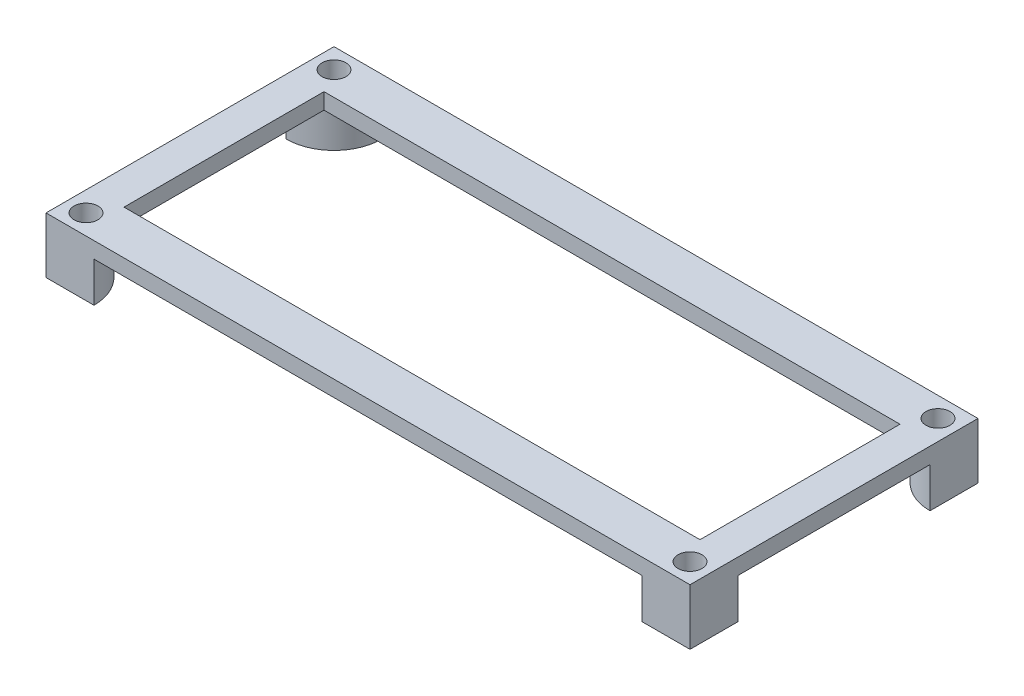
ISO-10303-21;
HEADER;
FILE_DESCRIPTION(('STEP AP214'),'2;1');
FILE_NAME('part.step','',(''),(''),'','','');
FILE_SCHEMA(('AUTOMOTIVE_DESIGN { 1 0 10303 214 1 1 1 1 }'));
ENDSEC;
DATA;
#1=APPLICATION_CONTEXT('core data for automotive mechanical design processes');
#2=APPLICATION_PROTOCOL_DEFINITION('international standard','automotive_design',2000,#1);
#3=PRODUCT_CONTEXT('',#1,'mechanical');
#4=PRODUCT('Part','Part','',(#3));
#5=PRODUCT_RELATED_PRODUCT_CATEGORY('part','',(#4));
#6=PRODUCT_DEFINITION_FORMATION('','',#4);
#7=PRODUCT_DEFINITION_CONTEXT('part definition',#1,'design');
#8=PRODUCT_DEFINITION('design','',#6,#7);
#9=PRODUCT_DEFINITION_SHAPE('','',#8);
#10=(LENGTH_UNIT() NAMED_UNIT(*) SI_UNIT(.MILLI.,.METRE.));
#11=(NAMED_UNIT(*) PLANE_ANGLE_UNIT() SI_UNIT($,.RADIAN.));
#12=(NAMED_UNIT(*) SI_UNIT($,.STERADIAN.) SOLID_ANGLE_UNIT());
#13=UNCERTAINTY_MEASURE_WITH_UNIT(LENGTH_MEASURE(1.E-05),#10,'distance_accuracy_value','');
#14=(GEOMETRIC_REPRESENTATION_CONTEXT(3) GLOBAL_UNCERTAINTY_ASSIGNED_CONTEXT((#13)) GLOBAL_UNIT_ASSIGNED_CONTEXT((#10,
#11,#12)) REPRESENTATION_CONTEXT('',''));
#15=CARTESIAN_POINT('',(0.,0.,0.));
#16=DIRECTION('',(0.,0.,1.));
#17=DIRECTION('',(1.,0.,0.));
#18=AXIS2_PLACEMENT_3D('',#15,#16,#17);
#19=CARTESIAN_POINT('',(0.,0.,0.));
#20=DIRECTION('',(1.,0.,0.));
#21=DIRECTION('',(0.,0.,-1.));
#22=AXIS2_PLACEMENT_3D('',#19,#20,#21);
#23=PLANE('',#22);
#24=DIRECTION('',(0.,0.,1.));
#25=VECTOR('',#24,1.);
#26=CARTESIAN_POINT('',(0.,12.,0.));
#27=LINE('',#26,#25);
#28=CARTESIAN_POINT('',(0.,12.,-36.));
#29=VERTEX_POINT('',#28);
#30=CARTESIAN_POINT('',(0.,12.,0.));
#31=VERTEX_POINT('',#30);
#32=EDGE_CURVE('E12',#29,#31,#27,.T.);
#33=ORIENTED_EDGE('',*,*,#32,.F.);
#34=DIRECTION('',(0.,-1.,0.));
#35=VECTOR('',#34,1.);
#36=CARTESIAN_POINT('',(0.,12.,-36.));
#37=LINE('',#36,#35);
#38=CARTESIAN_POINT('',(0.,5.,-36.));
#39=VERTEX_POINT('',#38);
#40=EDGE_CURVE('E312',#29,#39,#37,.T.);
#41=ORIENTED_EDGE('',*,*,#40,.T.);
#42=DIRECTION('',(0.,0.,1.));
#43=VECTOR('',#42,1.);
#44=CARTESIAN_POINT('',(0.,5.,0.));
#45=LINE('',#44,#43);
#46=CARTESIAN_POINT('',(0.,5.,-30.));
#47=VERTEX_POINT('',#46);
#48=EDGE_CURVE('E377',#39,#47,#45,.T.);
#49=ORIENTED_EDGE('',*,*,#48,.T.);
#50=DIRECTION('',(0.,1.,0.));
#51=VECTOR('',#50,1.);
#52=CARTESIAN_POINT('',(0.,1.,-30.));
#53=LINE('',#52,#51);
#54=CARTESIAN_POINT('',(0.,10.,-30.));
#55=VERTEX_POINT('',#54);
#56=EDGE_CURVE('E202',#47,#55,#53,.T.);
#57=ORIENTED_EDGE('',*,*,#56,.T.);
#58=DIRECTION('',(0.,0.,-1.));
#59=VECTOR('',#58,1.);
#60=CARTESIAN_POINT('',(0.,10.,0.));
#61=LINE('',#60,#59);
#62=CARTESIAN_POINT('',(0.,10.,-6.));
#63=VERTEX_POINT('',#62);
#64=EDGE_CURVE('E56',#63,#55,#61,.T.);
#65=ORIENTED_EDGE('',*,*,#64,.F.);
#66=DIRECTION('',(0.,1.,0.));
#67=VECTOR('',#66,1.);
#68=CARTESIAN_POINT('',(0.,1.,-6.));
#69=LINE('',#68,#67);
#70=CARTESIAN_POINT('',(0.,5.,-6.));
#71=VERTEX_POINT('',#70);
#72=EDGE_CURVE('E209',#71,#63,#69,.T.);
#73=ORIENTED_EDGE('',*,*,#72,.F.);
#74=CARTESIAN_POINT('',(0.,5.,0.));
#75=VERTEX_POINT('',#74);
#76=EDGE_CURVE('E49',#71,#75,#45,.T.);
#77=ORIENTED_EDGE('',*,*,#76,.T.);
#78=DIRECTION('',(0.,-1.,0.));
#79=VECTOR('',#78,1.);
#80=CARTESIAN_POINT('',(0.,12.,0.));
#81=LINE('',#80,#79);
#82=EDGE_CURVE('E315',#31,#75,#81,.T.);
#83=ORIENTED_EDGE('',*,*,#82,.F.);
#84=EDGE_LOOP('',(#33,#41,#49,#57,#65,#73,#77,#83));
#85=FACE_BOUND('',#84,.T.);
#86=ADVANCED_FACE('F45',(#85),#23,.F.);
#87=CARTESIAN_POINT('',(0.,5.,0.));
#88=DIRECTION('',(0.,1.,0.));
#89=DIRECTION('',(0.,0.,1.));
#90=AXIS2_PLACEMENT_3D('',#87,#88,#89);
#91=PLANE('',#90);
#92=CARTESIAN_POINT('',(78.,5.,-33.5));
#93=DIRECTION('',(0.,1.,0.));
#94=DIRECTION('',(0.,0.,1.));
#95=AXIS2_PLACEMENT_3D('',#92,#93,#94);
#96=CIRCLE('',#95,1.5);
#97=CARTESIAN_POINT('',(78.,5.,-32.));
#98=VERTEX_POINT('',#97);
#99=EDGE_CURVE('E287',#98,#98,#96,.F.);
#100=ORIENTED_EDGE('',*,*,#99,.F.);
#101=EDGE_LOOP('',(#100));
#102=FACE_BOUND('',#101,.T.);
#103=CARTESIAN_POINT('',(80.5,5.,-36.));
#104=DIRECTION('',(0.,1.,0.));
#105=DIRECTION('',(0.,0.,1.));
#106=AXIS2_PLACEMENT_3D('',#103,#104,#105);
#107=CIRCLE('',#106,6.);
#108=CARTESIAN_POINT('',(74.5,5.,-36.));
#109=VERTEX_POINT('',#108);
#110=CARTESIAN_POINT('',(80.5,5.,-30.));
#111=VERTEX_POINT('',#110);
#112=EDGE_CURVE('E166',#109,#111,#107,.T.);
#113=ORIENTED_EDGE('',*,*,#112,.F.);
#114=DIRECTION('',(1.,0.,0.));
#115=VECTOR('',#114,1.);
#116=CARTESIAN_POINT('',(0.,5.,-36.));
#117=LINE('',#116,#115);
#118=CARTESIAN_POINT('',(80.5,5.,-36.));
#119=VERTEX_POINT('',#118);
#120=EDGE_CURVE('E169',#109,#119,#117,.T.);
#121=ORIENTED_EDGE('',*,*,#120,.T.);
#122=DIRECTION('',(0.,0.,-1.));
#123=VECTOR('',#122,1.);
#124=CARTESIAN_POINT('',(80.5,5.,0.));
#125=LINE('',#124,#123);
#126=EDGE_CURVE('E171',#111,#119,#125,.T.);
#127=ORIENTED_EDGE('',*,*,#126,.F.);
#128=EDGE_LOOP('',(#113,#121,#127));
#129=FACE_BOUND('',#128,.T.);
#130=ADVANCED_FACE('F168',(#102,#129),#91,.F.);
#131=CARTESIAN_POINT('',(78.,5.,-2.5));
#132=DIRECTION('',(0.,1.,0.));
#133=DIRECTION('',(0.,0.,1.));
#134=AXIS2_PLACEMENT_3D('',#131,#132,#133);
#135=CIRCLE('',#134,1.5);
#136=CARTESIAN_POINT('',(78.,5.,-1.));
#137=VERTEX_POINT('',#136);
#138=EDGE_CURVE('E189',#137,#137,#135,.T.);
#139=ORIENTED_EDGE('',*,*,#138,.T.);
#140=EDGE_LOOP('',(#139));
#141=FACE_BOUND('',#140,.T.);
#142=CARTESIAN_POINT('',(80.5,5.,0.));
#143=DIRECTION('',(0.,1.,0.));
#144=DIRECTION('',(0.,0.,1.));
#145=AXIS2_PLACEMENT_3D('',#142,#143,#144);
#146=CIRCLE('',#145,6.);
#147=CARTESIAN_POINT('',(80.5,5.,-6.));
#148=VERTEX_POINT('',#147);
#149=CARTESIAN_POINT('',(74.5,5.,0.));
#150=VERTEX_POINT('',#149);
#151=EDGE_CURVE('E177',#148,#150,#146,.T.);
#152=ORIENTED_EDGE('',*,*,#151,.F.);
#153=CARTESIAN_POINT('',(80.5,5.,0.));
#154=VERTEX_POINT('',#153);
#155=EDGE_CURVE('E291',#154,#148,#125,.T.);
#156=ORIENTED_EDGE('',*,*,#155,.F.);
#157=DIRECTION('',(1.,0.,0.));
#158=VECTOR('',#157,1.);
#159=CARTESIAN_POINT('',(0.,5.,0.));
#160=LINE('',#159,#158);
#161=EDGE_CURVE('E295',#150,#154,#160,.T.);
#162=ORIENTED_EDGE('',*,*,#161,.F.);
#163=EDGE_LOOP('',(#152,#156,#162));
#164=FACE_BOUND('',#163,.T.);
#165=ADVANCED_FACE('F396',(#141,#164),#91,.F.);
#166=CARTESIAN_POINT('',(2.5,5.,-2.5));
#167=DIRECTION('',(0.,1.,0.));
#168=DIRECTION('',(0.,0.,1.));
#169=AXIS2_PLACEMENT_3D('',#166,#167,#168);
#170=CIRCLE('',#169,1.5);
#171=CARTESIAN_POINT('',(2.5,5.,-1.));
#172=VERTEX_POINT('',#171);
#173=EDGE_CURVE('E283',#172,#172,#170,.F.);
#174=ORIENTED_EDGE('',*,*,#173,.F.);
#175=EDGE_LOOP('',(#174));
#176=FACE_BOUND('',#175,.T.);
#177=ORIENTED_EDGE('',*,*,#76,.F.);
#178=CARTESIAN_POINT('',(0.,5.,0.));
#179=DIRECTION('',(0.,1.,0.));
#180=DIRECTION('',(0.,0.,1.));
#181=AXIS2_PLACEMENT_3D('',#178,#179,#180);
#182=CIRCLE('',#181,6.);
#183=CARTESIAN_POINT('',(6.,5.,0.));
#184=VERTEX_POINT('',#183);
#185=EDGE_CURVE('E276',#184,#71,#182,.T.);
#186=ORIENTED_EDGE('',*,*,#185,.F.);
#187=EDGE_CURVE('E296',#75,#184,#160,.T.);
#188=ORIENTED_EDGE('',*,*,#187,.F.);
#189=EDGE_LOOP('',(#177,#186,#188));
#190=FACE_BOUND('',#189,.T.);
#191=ADVANCED_FACE('F386',(#176,#190),#91,.F.);
#192=CARTESIAN_POINT('',(2.5,5.,-33.5));
#193=DIRECTION('',(0.,1.,0.));
#194=DIRECTION('',(0.,0.,1.));
#195=AXIS2_PLACEMENT_3D('',#192,#193,#194);
#196=CIRCLE('',#195,1.5);
#197=CARTESIAN_POINT('',(2.5,5.,-32.));
#198=VERTEX_POINT('',#197);
#199=EDGE_CURVE('E303',#198,#198,#196,.T.);
#200=ORIENTED_EDGE('',*,*,#199,.T.);
#201=EDGE_LOOP('',(#200));
#202=FACE_BOUND('',#201,.T.);
#203=CARTESIAN_POINT('',(0.,5.,-36.));
#204=DIRECTION('',(0.,1.,0.));
#205=DIRECTION('',(0.,0.,1.));
#206=AXIS2_PLACEMENT_3D('',#203,#204,#205);
#207=CIRCLE('',#206,6.);
#208=CARTESIAN_POINT('',(6.,5.,-36.));
#209=VERTEX_POINT('',#208);
#210=EDGE_CURVE('E279',#47,#209,#207,.T.);
#211=ORIENTED_EDGE('',*,*,#210,.F.);
#212=ORIENTED_EDGE('',*,*,#48,.F.);
#213=EDGE_CURVE('E188',#39,#209,#117,.T.);
#214=ORIENTED_EDGE('',*,*,#213,.T.);
#215=EDGE_LOOP('',(#211,#212,#214));
#216=FACE_BOUND('',#215,.T.);
#217=ADVANCED_FACE('F47',(#202,#216),#91,.F.);
#218=CARTESIAN_POINT('',(4.25,10.,-5.50000000000001));
#219=DIRECTION('',(-1.,0.,0.));
#220=DIRECTION('',(0.,0.,1.));
#221=AXIS2_PLACEMENT_3D('',#218,#219,#220);
#222=PLANE('',#221);
#223=DIRECTION('',(0.,0.,1.));
#224=VECTOR('',#223,1.);
#225=CARTESIAN_POINT('',(4.25,12.,-5.50000000000001));
#226=LINE('',#225,#224);
#227=CARTESIAN_POINT('',(4.25,12.,-30.5));
#228=VERTEX_POINT('',#227);
#229=CARTESIAN_POINT('',(4.25,12.,-5.50000000000001));
#230=VERTEX_POINT('',#229);
#231=EDGE_CURVE('E248',#228,#230,#226,.T.);
#232=ORIENTED_EDGE('',*,*,#231,.T.);
#233=DIRECTION('',(0.,1.,0.));
#234=VECTOR('',#233,1.);
#235=CARTESIAN_POINT('',(4.25,10.,-5.50000000000001));
#236=LINE('',#235,#234);
#237=CARTESIAN_POINT('',(4.25,10.,-5.50000000000001));
#238=VERTEX_POINT('',#237);
#239=EDGE_CURVE('E77',#238,#230,#236,.T.);
#240=ORIENTED_EDGE('',*,*,#239,.F.);
#241=DIRECTION('',(0.,0.,1.));
#242=VECTOR('',#241,1.);
#243=CARTESIAN_POINT('',(4.25,10.,-5.50000000000001));
#244=LINE('',#243,#242);
#245=CARTESIAN_POINT('',(4.25,10.,-30.5));
#246=VERTEX_POINT('',#245);
#247=EDGE_CURVE('E261',#246,#238,#244,.T.);
#248=ORIENTED_EDGE('',*,*,#247,.F.);
#249=DIRECTION('',(0.,1.,0.));
#250=VECTOR('',#249,1.);
#251=CARTESIAN_POINT('',(4.25,10.,-30.5));
#252=LINE('',#251,#250);
#253=EDGE_CURVE('E65',#246,#228,#252,.T.);
#254=ORIENTED_EDGE('',*,*,#253,.T.);
#255=EDGE_LOOP('',(#232,#240,#248,#254));
#256=FACE_BOUND('',#255,.T.);
#257=ADVANCED_FACE('F507',(#256),#222,.F.);
#258=CARTESIAN_POINT('',(4.25,10.,-30.5));
#259=DIRECTION('',(0.,0.,-1.));
#260=DIRECTION('',(-1.,0.,0.));
#261=AXIS2_PLACEMENT_3D('',#258,#259,#260);
#262=PLANE('',#261);
#263=DIRECTION('',(-1.,0.,0.));
#264=VECTOR('',#263,1.);
#265=CARTESIAN_POINT('',(4.25,12.,-30.5));
#266=LINE('',#265,#264);
#267=CARTESIAN_POINT('',(76.25,12.,-30.5));
#268=VERTEX_POINT('',#267);
#269=EDGE_CURVE('E252',#268,#228,#266,.T.);
#270=ORIENTED_EDGE('',*,*,#269,.T.);
#271=ORIENTED_EDGE('',*,*,#253,.F.);
#272=DIRECTION('',(-1.,0.,0.));
#273=VECTOR('',#272,1.);
#274=CARTESIAN_POINT('',(4.25,10.,-30.5));
#275=LINE('',#274,#273);
#276=CARTESIAN_POINT('',(76.25,10.,-30.5));
#277=VERTEX_POINT('',#276);
#278=EDGE_CURVE('E265',#277,#246,#275,.T.);
#279=ORIENTED_EDGE('',*,*,#278,.F.);
#280=DIRECTION('',(0.,1.,0.));
#281=VECTOR('',#280,1.);
#282=CARTESIAN_POINT('',(76.25,10.,-30.5));
#283=LINE('',#282,#281);
#284=EDGE_CURVE('E84',#277,#268,#283,.T.);
#285=ORIENTED_EDGE('',*,*,#284,.T.);
#286=EDGE_LOOP('',(#270,#271,#279,#285));
#287=FACE_BOUND('',#286,.T.);
#288=ADVANCED_FACE('F498',(#287),#262,.F.);
#289=CARTESIAN_POINT('',(76.25,10.,-5.50000000000001));
#290=DIRECTION('',(1.,0.,0.));
#291=DIRECTION('',(0.,0.,-1.));
#292=AXIS2_PLACEMENT_3D('',#289,#290,#291);
#293=PLANE('',#292);
#294=DIRECTION('',(0.,0.,-1.));
#295=VECTOR('',#294,1.);
#296=CARTESIAN_POINT('',(76.25,12.,-5.50000000000001));
#297=LINE('',#296,#295);
#298=CARTESIAN_POINT('',(76.25,12.,-5.50000000000001));
#299=VERTEX_POINT('',#298);
#300=EDGE_CURVE('E255',#299,#268,#297,.T.);
#301=ORIENTED_EDGE('',*,*,#300,.T.);
#302=ORIENTED_EDGE('',*,*,#284,.F.);
#303=DIRECTION('',(0.,0.,-1.));
#304=VECTOR('',#303,1.);
#305=CARTESIAN_POINT('',(76.25,10.,-5.50000000000001));
#306=LINE('',#305,#304);
#307=CARTESIAN_POINT('',(76.25,10.,-5.50000000000001));
#308=VERTEX_POINT('',#307);
#309=EDGE_CURVE('E249',#308,#277,#306,.T.);
#310=ORIENTED_EDGE('',*,*,#309,.F.);
#311=DIRECTION('',(0.,1.,0.));
#312=VECTOR('',#311,1.);
#313=CARTESIAN_POINT('',(76.25,10.,-5.50000000000001));
#314=LINE('',#313,#312);
#315=EDGE_CURVE('E87',#308,#299,#314,.T.);
#316=ORIENTED_EDGE('',*,*,#315,.T.);
#317=EDGE_LOOP('',(#301,#302,#310,#316));
#318=FACE_BOUND('',#317,.T.);
#319=ADVANCED_FACE('F492',(#318),#293,.F.);
#320=CARTESIAN_POINT('',(4.25,10.,-5.50000000000001));
#321=DIRECTION('',(0.,0.,1.));
#322=DIRECTION('',(1.,0.,0.));
#323=AXIS2_PLACEMENT_3D('',#320,#321,#322);
#324=PLANE('',#323);
#325=DIRECTION('',(1.,0.,0.));
#326=VECTOR('',#325,1.);
#327=CARTESIAN_POINT('',(4.25,12.,-5.50000000000001));
#328=LINE('',#327,#326);
#329=EDGE_CURVE('E245',#230,#299,#328,.T.);
#330=ORIENTED_EDGE('',*,*,#329,.T.);
#331=ORIENTED_EDGE('',*,*,#315,.F.);
#332=DIRECTION('',(1.,0.,0.));
#333=VECTOR('',#332,1.);
#334=CARTESIAN_POINT('',(4.25,10.,-5.50000000000001));
#335=LINE('',#334,#333);
#336=EDGE_CURVE('E238',#238,#308,#335,.T.);
#337=ORIENTED_EDGE('',*,*,#336,.F.);
#338=ORIENTED_EDGE('',*,*,#239,.T.);
#339=EDGE_LOOP('',(#330,#331,#337,#338));
#340=FACE_BOUND('',#339,.T.);
#341=ADVANCED_FACE('F407',(#340),#324,.F.);
#342=CARTESIAN_POINT('',(0.,12.,0.));
#343=DIRECTION('',(0.,1.,0.));
#344=DIRECTION('',(0.,0.,1.));
#345=AXIS2_PLACEMENT_3D('',#342,#343,#344);
#346=PLANE('',#345);
#347=DIRECTION('',(0.,0.,-1.));
#348=VECTOR('',#347,1.);
#349=CARTESIAN_POINT('',(80.5,12.,0.));
#350=LINE('',#349,#348);
#351=CARTESIAN_POINT('',(80.5,12.,0.));
#352=VERTEX_POINT('',#351);
#353=CARTESIAN_POINT('',(80.5,12.,-36.));
#354=VERTEX_POINT('',#353);
#355=EDGE_CURVE('E336',#352,#354,#350,.T.);
#356=ORIENTED_EDGE('',*,*,#355,.T.);
#357=DIRECTION('',(1.,0.,0.));
#358=VECTOR('',#357,1.);
#359=CARTESIAN_POINT('',(0.,12.,-36.));
#360=LINE('',#359,#358);
#361=EDGE_CURVE('E330',#29,#354,#360,.T.);
#362=ORIENTED_EDGE('',*,*,#361,.F.);
#363=ORIENTED_EDGE('',*,*,#32,.T.);
#364=DIRECTION('',(1.,0.,0.));
#365=VECTOR('',#364,1.);
#366=CARTESIAN_POINT('',(0.,12.,0.));
#367=LINE('',#366,#365);
#368=EDGE_CURVE('E340',#31,#352,#367,.T.);
#369=ORIENTED_EDGE('',*,*,#368,.T.);
#370=EDGE_LOOP('',(#356,#362,#363,#369));
#371=FACE_BOUND('',#370,.T.);
#372=CARTESIAN_POINT('',(78.,12.,-2.5));
#373=DIRECTION('',(0.,1.,0.));
#374=DIRECTION('',(0.,0.,1.));
#375=AXIS2_PLACEMENT_3D('',#372,#373,#374);
#376=CIRCLE('',#375,1.5);
#377=CARTESIAN_POINT('',(78.,12.,-1.));
#378=VERTEX_POINT('',#377);
#379=EDGE_CURVE('E324',#378,#378,#376,.T.);
#380=ORIENTED_EDGE('',*,*,#379,.F.);
#381=EDGE_LOOP('',(#380));
#382=FACE_BOUND('',#381,.T.);
#383=ORIENTED_EDGE('',*,*,#300,.F.);
#384=ORIENTED_EDGE('',*,*,#329,.F.);
#385=ORIENTED_EDGE('',*,*,#231,.F.);
#386=ORIENTED_EDGE('',*,*,#269,.F.);
#387=EDGE_LOOP('',(#383,#384,#385,#386));
#388=FACE_BOUND('',#387,.T.);
#389=CARTESIAN_POINT('',(78.,12.,-33.5));
#390=DIRECTION('',(0.,1.,0.));
#391=DIRECTION('',(0.,0.,1.));
#392=AXIS2_PLACEMENT_3D('',#389,#390,#391);
#393=CIRCLE('',#392,1.5);
#394=CARTESIAN_POINT('',(78.,12.,-32.));
#395=VERTEX_POINT('',#394);
#396=EDGE_CURVE('E213',#395,#395,#393,.F.);
#397=ORIENTED_EDGE('',*,*,#396,.T.);
#398=EDGE_LOOP('',(#397));
#399=FACE_BOUND('',#398,.T.);
#400=CARTESIAN_POINT('',(2.5,12.,-33.5));
#401=DIRECTION('',(0.,1.,0.));
#402=DIRECTION('',(0.,0.,1.));
#403=AXIS2_PLACEMENT_3D('',#400,#401,#402);
#404=CIRCLE('',#403,1.5);
#405=CARTESIAN_POINT('',(2.5,12.,-32.));
#406=VERTEX_POINT('',#405);
#407=EDGE_CURVE('E343',#406,#406,#404,.T.);
#408=ORIENTED_EDGE('',*,*,#407,.F.);
#409=EDGE_LOOP('',(#408));
#410=FACE_BOUND('',#409,.T.);
#411=CARTESIAN_POINT('',(2.5,12.,-2.5));
#412=DIRECTION('',(0.,1.,0.));
#413=DIRECTION('',(0.,0.,1.));
#414=AXIS2_PLACEMENT_3D('',#411,#412,#413);
#415=CIRCLE('',#414,1.5);
#416=CARTESIAN_POINT('',(2.5,12.,-1.));
#417=VERTEX_POINT('',#416);
#418=EDGE_CURVE('E318',#417,#417,#415,.F.);
#419=ORIENTED_EDGE('',*,*,#418,.T.);
#420=EDGE_LOOP('',(#419));
#421=FACE_BOUND('',#420,.T.);
#422=ADVANCED_FACE('F403',(#371,#382,#388,#399,#410,#421),#346,.T.);
#423=CARTESIAN_POINT('',(2.5,12.,-2.5));
#424=DIRECTION('',(0.,-1.,0.));
#425=DIRECTION('',(0.,0.,-1.));
#426=AXIS2_PLACEMENT_3D('',#423,#424,#425);
#427=CYLINDRICAL_SURFACE('',#426,1.5);
#428=ORIENTED_EDGE('',*,*,#173,.T.);
#429=EDGE_LOOP('',(#428));
#430=FACE_BOUND('',#429,.T.);
#431=ORIENTED_EDGE('',*,*,#418,.F.);
#432=EDGE_LOOP('',(#431));
#433=FACE_BOUND('',#432,.T.);
#434=ADVANCED_FACE('F406',(#430,#433),#427,.F.);
#435=CARTESIAN_POINT('',(78.,12.,-33.5));
#436=DIRECTION('',(0.,-1.,0.));
#437=DIRECTION('',(0.,0.,-1.));
#438=AXIS2_PLACEMENT_3D('',#435,#436,#437);
#439=CYLINDRICAL_SURFACE('',#438,1.5);
#440=ORIENTED_EDGE('',*,*,#99,.T.);
#441=EDGE_LOOP('',(#440));
#442=FACE_BOUND('',#441,.T.);
#443=ORIENTED_EDGE('',*,*,#396,.F.);
#444=EDGE_LOOP('',(#443));
#445=FACE_BOUND('',#444,.T.);
#446=ADVANCED_FACE('F422',(#442,#445),#439,.F.);
#447=CARTESIAN_POINT('',(2.5,12.,-33.5));
#448=DIRECTION('',(0.,-1.,0.));
#449=DIRECTION('',(0.,0.,-1.));
#450=AXIS2_PLACEMENT_3D('',#447,#448,#449);
#451=CYLINDRICAL_SURFACE('',#450,1.5);
#452=ORIENTED_EDGE('',*,*,#199,.F.);
#453=EDGE_LOOP('',(#452));
#454=FACE_BOUND('',#453,.T.);
#455=ORIENTED_EDGE('',*,*,#407,.T.);
#456=EDGE_LOOP('',(#455));
#457=FACE_BOUND('',#456,.T.);
#458=ADVANCED_FACE('F419',(#454,#457),#451,.F.);
#459=CARTESIAN_POINT('',(78.,12.,-2.5));
#460=DIRECTION('',(0.,-1.,0.));
#461=DIRECTION('',(0.,0.,-1.));
#462=AXIS2_PLACEMENT_3D('',#459,#460,#461);
#463=CYLINDRICAL_SURFACE('',#462,1.5);
#464=ORIENTED_EDGE('',*,*,#138,.F.);
#465=EDGE_LOOP('',(#464));
#466=FACE_BOUND('',#465,.T.);
#467=ORIENTED_EDGE('',*,*,#379,.T.);
#468=EDGE_LOOP('',(#467));
#469=FACE_BOUND('',#468,.T.);
#470=ADVANCED_FACE('F421',(#466,#469),#463,.F.);
#471=CARTESIAN_POINT('',(80.5,12.,0.));
#472=DIRECTION('',(-1.,0.,0.));
#473=DIRECTION('',(0.,0.,1.));
#474=AXIS2_PLACEMENT_3D('',#471,#472,#473);
#475=PLANE('',#474);
#476=DIRECTION('',(0.,-1.,0.));
#477=VECTOR('',#476,1.);
#478=CARTESIAN_POINT('',(80.5,12.,0.));
#479=LINE('',#478,#477);
#480=EDGE_CURVE('E176',#352,#154,#479,.T.);
#481=ORIENTED_EDGE('',*,*,#480,.T.);
#482=ORIENTED_EDGE('',*,*,#155,.T.);
#483=DIRECTION('',(0.,1.,0.));
#484=VECTOR('',#483,1.);
#485=CARTESIAN_POINT('',(80.5,1.,-6.));
#486=LINE('',#485,#484);
#487=CARTESIAN_POINT('',(80.5,10.,-6.));
#488=VERTEX_POINT('',#487);
#489=EDGE_CURVE('E200',#148,#488,#486,.T.);
#490=ORIENTED_EDGE('',*,*,#489,.T.);
#491=DIRECTION('',(0.,0.,-1.));
#492=VECTOR('',#491,1.);
#493=CARTESIAN_POINT('',(80.5,10.,-36.));
#494=LINE('',#493,#492);
#495=CARTESIAN_POINT('',(80.5,10.,-30.));
#496=VERTEX_POINT('',#495);
#497=EDGE_CURVE('E228',#488,#496,#494,.T.);
#498=ORIENTED_EDGE('',*,*,#497,.T.);
#499=DIRECTION('',(0.,1.,0.));
#500=VECTOR('',#499,1.);
#501=CARTESIAN_POINT('',(80.5,1.,-30.));
#502=LINE('',#501,#500);
#503=EDGE_CURVE('E195',#111,#496,#502,.T.);
#504=ORIENTED_EDGE('',*,*,#503,.F.);
#505=ORIENTED_EDGE('',*,*,#126,.T.);
#506=DIRECTION('',(0.,-1.,0.));
#507=VECTOR('',#506,1.);
#508=CARTESIAN_POINT('',(80.5,12.,-36.));
#509=LINE('',#508,#507);
#510=EDGE_CURVE('E186',#354,#119,#509,.T.);
#511=ORIENTED_EDGE('',*,*,#510,.F.);
#512=ORIENTED_EDGE('',*,*,#355,.F.);
#513=EDGE_LOOP('',(#481,#482,#490,#498,#504,#505,#511,#512));
#514=FACE_BOUND('',#513,.T.);
#515=ADVANCED_FACE('F360',(#514),#475,.F.);
#516=CARTESIAN_POINT('',(0.,12.,0.));
#517=DIRECTION('',(0.,0.,-1.));
#518=DIRECTION('',(-1.,0.,0.));
#519=AXIS2_PLACEMENT_3D('',#516,#517,#518);
#520=PLANE('',#519);
#521=ORIENTED_EDGE('',*,*,#82,.T.);
#522=ORIENTED_EDGE('',*,*,#187,.T.);
#523=DIRECTION('',(0.,1.,0.));
#524=VECTOR('',#523,1.);
#525=CARTESIAN_POINT('',(6.,1.,0.));
#526=LINE('',#525,#524);
#527=CARTESIAN_POINT('',(6.,10.,0.));
#528=VERTEX_POINT('',#527);
#529=EDGE_CURVE('E219',#184,#528,#526,.T.);
#530=ORIENTED_EDGE('',*,*,#529,.T.);
#531=DIRECTION('',(1.,0.,0.));
#532=VECTOR('',#531,1.);
#533=CARTESIAN_POINT('',(0.,10.,0.));
#534=LINE('',#533,#532);
#535=CARTESIAN_POINT('',(74.5,10.,0.));
#536=VERTEX_POINT('',#535);
#537=EDGE_CURVE('E232',#528,#536,#534,.T.);
#538=ORIENTED_EDGE('',*,*,#537,.T.);
#539=DIRECTION('',(0.,1.,0.));
#540=VECTOR('',#539,1.);
#541=CARTESIAN_POINT('',(74.5,1.,0.));
#542=LINE('',#541,#540);
#543=EDGE_CURVE('E353',#150,#536,#542,.T.);
#544=ORIENTED_EDGE('',*,*,#543,.F.);
#545=ORIENTED_EDGE('',*,*,#161,.T.);
#546=ORIENTED_EDGE('',*,*,#480,.F.);
#547=ORIENTED_EDGE('',*,*,#368,.F.);
#548=EDGE_LOOP('',(#521,#522,#530,#538,#544,#545,#546,#547));
#549=FACE_BOUND('',#548,.T.);
#550=ADVANCED_FACE('F388',(#549),#520,.F.);
#551=CARTESIAN_POINT('',(0.,10.,0.));
#552=DIRECTION('',(0.,1.,0.));
#553=DIRECTION('',(0.,0.,1.));
#554=AXIS2_PLACEMENT_3D('',#551,#552,#553);
#555=PLANE('',#554);
#556=ORIENTED_EDGE('',*,*,#336,.T.);
#557=ORIENTED_EDGE('',*,*,#309,.T.);
#558=ORIENTED_EDGE('',*,*,#278,.T.);
#559=ORIENTED_EDGE('',*,*,#247,.T.);
#560=EDGE_LOOP('',(#556,#557,#558,#559));
#561=FACE_BOUND('',#560,.T.);
#562=ORIENTED_EDGE('',*,*,#537,.F.);
#563=CARTESIAN_POINT('',(0.,10.,0.));
#564=DIRECTION('',(0.,1.,0.));
#565=DIRECTION('',(0.,0.,1.));
#566=AXIS2_PLACEMENT_3D('',#563,#564,#565);
#567=CIRCLE('',#566,6.);
#568=EDGE_CURVE('E214',#528,#63,#567,.T.);
#569=ORIENTED_EDGE('',*,*,#568,.T.);
#570=ORIENTED_EDGE('',*,*,#64,.T.);
#571=CARTESIAN_POINT('',(0.,10.,-36.));
#572=DIRECTION('',(0.,1.,0.));
#573=DIRECTION('',(0.,0.,1.));
#574=AXIS2_PLACEMENT_3D('',#571,#572,#573);
#575=CIRCLE('',#574,6.);
#576=CARTESIAN_POINT('',(6.,10.,-36.));
#577=VERTEX_POINT('',#576);
#578=EDGE_CURVE('E218',#55,#577,#575,.T.);
#579=ORIENTED_EDGE('',*,*,#578,.T.);
#580=DIRECTION('',(-1.,0.,0.));
#581=VECTOR('',#580,1.);
#582=CARTESIAN_POINT('',(0.,10.,-36.));
#583=LINE('',#582,#581);
#584=CARTESIAN_POINT('',(74.5,10.,-36.));
#585=VERTEX_POINT('',#584);
#586=EDGE_CURVE('E225',#585,#577,#583,.T.);
#587=ORIENTED_EDGE('',*,*,#586,.F.);
#588=CARTESIAN_POINT('',(80.5,10.,-36.));
#589=DIRECTION('',(0.,1.,0.));
#590=DIRECTION('',(0.,0.,1.));
#591=AXIS2_PLACEMENT_3D('',#588,#589,#590);
#592=CIRCLE('',#591,6.);
#593=EDGE_CURVE('E193',#585,#496,#592,.T.);
#594=ORIENTED_EDGE('',*,*,#593,.T.);
#595=ORIENTED_EDGE('',*,*,#497,.F.);
#596=CARTESIAN_POINT('',(80.5,10.,0.));
#597=DIRECTION('',(0.,1.,0.));
#598=DIRECTION('',(0.,0.,1.));
#599=AXIS2_PLACEMENT_3D('',#596,#597,#598);
#600=CIRCLE('',#599,6.);
#601=EDGE_CURVE('E282',#488,#536,#600,.T.);
#602=ORIENTED_EDGE('',*,*,#601,.T.);
#603=EDGE_LOOP('',(#562,#569,#570,#579,#587,#594,#595,#602));
#604=FACE_BOUND('',#603,.T.);
#605=ADVANCED_FACE('F366',(#561,#604),#555,.F.);
#606=CARTESIAN_POINT('',(0.,12.,-36.));
#607=DIRECTION('',(0.,0.,-1.));
#608=DIRECTION('',(-1.,0.,0.));
#609=AXIS2_PLACEMENT_3D('',#606,#607,#608);
#610=PLANE('',#609);
#611=ORIENTED_EDGE('',*,*,#213,.F.);
#612=ORIENTED_EDGE('',*,*,#40,.F.);
#613=ORIENTED_EDGE('',*,*,#361,.T.);
#614=ORIENTED_EDGE('',*,*,#510,.T.);
#615=ORIENTED_EDGE('',*,*,#120,.F.);
#616=DIRECTION('',(0.,1.,0.));
#617=VECTOR('',#616,1.);
#618=CARTESIAN_POINT('',(74.5,1.,-36.));
#619=LINE('',#618,#617);
#620=EDGE_CURVE('E183',#109,#585,#619,.T.);
#621=ORIENTED_EDGE('',*,*,#620,.T.);
#622=ORIENTED_EDGE('',*,*,#586,.T.);
#623=DIRECTION('',(0.,1.,0.));
#624=VECTOR('',#623,1.);
#625=CARTESIAN_POINT('',(6.,1.,-36.));
#626=LINE('',#625,#624);
#627=EDGE_CURVE('E196',#209,#577,#626,.T.);
#628=ORIENTED_EDGE('',*,*,#627,.F.);
#629=EDGE_LOOP('',(#611,#612,#613,#614,#615,#621,#622,#628));
#630=FACE_BOUND('',#629,.T.);
#631=ADVANCED_FACE('F181',(#630),#610,.T.);
#632=CARTESIAN_POINT('',(0.,1.,-36.));
#633=DIRECTION('',(0.,1.,0.));
#634=DIRECTION('',(0.,0.,1.));
#635=AXIS2_PLACEMENT_3D('',#632,#633,#634);
#636=CYLINDRICAL_SURFACE('',#635,6.);
#637=ORIENTED_EDGE('',*,*,#56,.F.);
#638=ORIENTED_EDGE('',*,*,#210,.T.);
#639=ORIENTED_EDGE('',*,*,#627,.T.);
#640=ORIENTED_EDGE('',*,*,#578,.F.);
#641=EDGE_LOOP('',(#637,#638,#639,#640));
#642=FACE_BOUND('',#641,.T.);
#643=ADVANCED_FACE('F374',(#642),#636,.T.);
#644=CARTESIAN_POINT('',(0.,1.,0.));
#645=DIRECTION('',(0.,1.,0.));
#646=DIRECTION('',(0.,0.,1.));
#647=AXIS2_PLACEMENT_3D('',#644,#645,#646);
#648=CYLINDRICAL_SURFACE('',#647,6.);
#649=ORIENTED_EDGE('',*,*,#529,.F.);
#650=ORIENTED_EDGE('',*,*,#185,.T.);
#651=ORIENTED_EDGE('',*,*,#72,.T.);
#652=ORIENTED_EDGE('',*,*,#568,.F.);
#653=EDGE_LOOP('',(#649,#650,#651,#652));
#654=FACE_BOUND('',#653,.T.);
#655=ADVANCED_FACE('F390',(#654),#648,.T.);
#656=CARTESIAN_POINT('',(80.5,1.,0.));
#657=DIRECTION('',(0.,1.,0.));
#658=DIRECTION('',(0.,0.,1.));
#659=AXIS2_PLACEMENT_3D('',#656,#657,#658);
#660=CYLINDRICAL_SURFACE('',#659,6.);
#661=ORIENTED_EDGE('',*,*,#489,.F.);
#662=ORIENTED_EDGE('',*,*,#151,.T.);
#663=ORIENTED_EDGE('',*,*,#543,.T.);
#664=ORIENTED_EDGE('',*,*,#601,.F.);
#665=EDGE_LOOP('',(#661,#662,#663,#664));
#666=FACE_BOUND('',#665,.T.);
#667=ADVANCED_FACE('F394',(#666),#660,.T.);
#668=CARTESIAN_POINT('',(80.5,1.,-36.));
#669=DIRECTION('',(0.,1.,0.));
#670=DIRECTION('',(0.,0.,1.));
#671=AXIS2_PLACEMENT_3D('',#668,#669,#670);
#672=CYLINDRICAL_SURFACE('',#671,6.);
#673=ORIENTED_EDGE('',*,*,#620,.F.);
#674=ORIENTED_EDGE('',*,*,#112,.T.);
#675=ORIENTED_EDGE('',*,*,#503,.T.);
#676=ORIENTED_EDGE('',*,*,#593,.F.);
#677=EDGE_LOOP('',(#673,#674,#675,#676));
#678=FACE_BOUND('',#677,.T.);
#679=ADVANCED_FACE('F191',(#678),#672,.T.);
#680=CLOSED_SHELL('',(#86,#130,#165,#191,#217,#257,#288,#319,#341,#422,#434,#446,#458,#470,#515,
#550,#605,#631,#643,#655,#667,#679));
#681=MANIFOLD_SOLID_BREP('B2',#680);
#682=ADVANCED_BREP_SHAPE_REPRESENTATION('',(#18,#681),#14);
#683=SHAPE_DEFINITION_REPRESENTATION(#9,#682);
ENDSEC;
END-ISO-10303-21;
